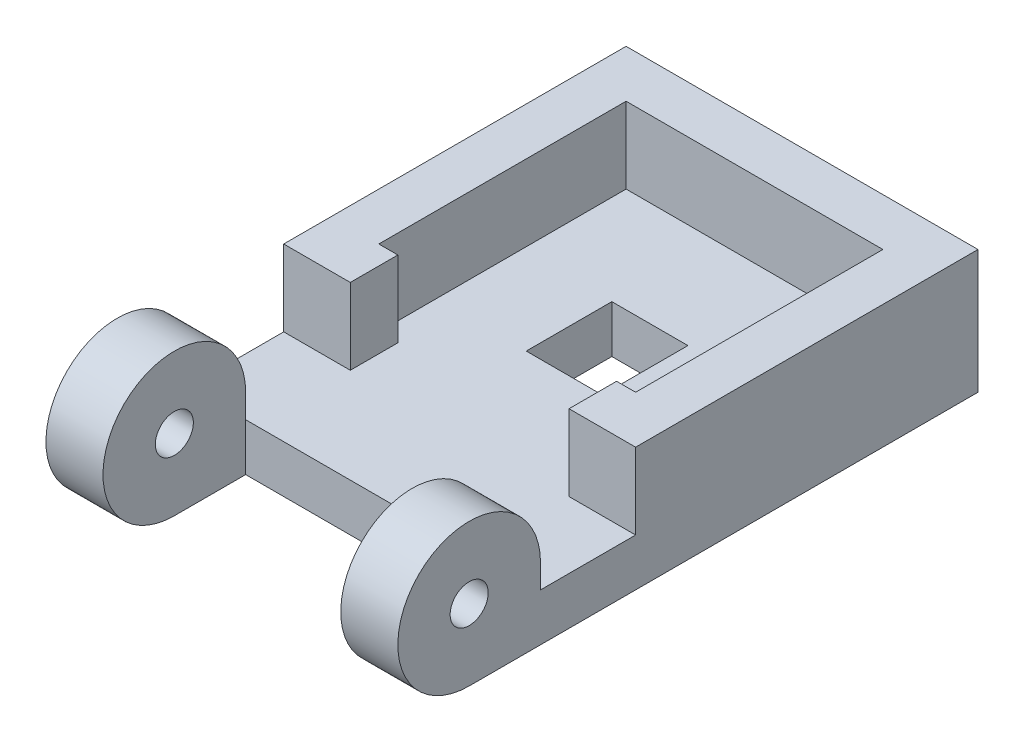
ISO-10303-21;
HEADER;
FILE_DESCRIPTION(('STEP AP214'),'2;1');
FILE_NAME('part.step','',(''),(''),'','','');
FILE_SCHEMA(('AUTOMOTIVE_DESIGN { 1 0 10303 214 1 1 1 1 }'));
ENDSEC;
DATA;
#1=APPLICATION_CONTEXT('core data for automotive mechanical design processes');
#2=APPLICATION_PROTOCOL_DEFINITION('international standard','automotive_design',2000,#1);
#3=PRODUCT_CONTEXT('',#1,'mechanical');
#4=PRODUCT('Part','Part','',(#3));
#5=PRODUCT_RELATED_PRODUCT_CATEGORY('part','',(#4));
#6=PRODUCT_DEFINITION_FORMATION('','',#4);
#7=PRODUCT_DEFINITION_CONTEXT('part definition',#1,'design');
#8=PRODUCT_DEFINITION('design','',#6,#7);
#9=PRODUCT_DEFINITION_SHAPE('','',#8);
#10=(LENGTH_UNIT() NAMED_UNIT(*) SI_UNIT(.MILLI.,.METRE.));
#11=(NAMED_UNIT(*) PLANE_ANGLE_UNIT() SI_UNIT($,.RADIAN.));
#12=(NAMED_UNIT(*) SI_UNIT($,.STERADIAN.) SOLID_ANGLE_UNIT());
#13=UNCERTAINTY_MEASURE_WITH_UNIT(LENGTH_MEASURE(1.E-05),#10,'distance_accuracy_value','');
#14=(GEOMETRIC_REPRESENTATION_CONTEXT(3) GLOBAL_UNCERTAINTY_ASSIGNED_CONTEXT((#13)) GLOBAL_UNIT_ASSIGNED_CONTEXT((#10,
#11,#12)) REPRESENTATION_CONTEXT('',''));
#15=CARTESIAN_POINT('',(0.,0.,0.));
#16=DIRECTION('',(0.,0.,1.));
#17=DIRECTION('',(1.,0.,0.));
#18=AXIS2_PLACEMENT_3D('',#15,#16,#17);
#19=CARTESIAN_POINT('',(0.,0.,0.));
#20=DIRECTION('',(0.,1.,0.));
#21=DIRECTION('',(0.,0.,1.));
#22=AXIS2_PLACEMENT_3D('',#19,#20,#21);
#23=PLANE('',#22);
#24=DIRECTION('',(0.,0.,-1.));
#25=VECTOR('',#24,1.);
#26=CARTESIAN_POINT('',(4.,0.,0.));
#27=LINE('',#26,#25);
#28=CARTESIAN_POINT('',(4.,0.,4.5));
#29=VERTEX_POINT('',#28);
#30=CARTESIAN_POINT('',(4.,0.,-4.5));
#31=VERTEX_POINT('',#30);
#32=EDGE_CURVE('E304',#29,#31,#27,.T.);
#33=ORIENTED_EDGE('',*,*,#32,.T.);
#34=DIRECTION('',(1.,0.,0.));
#35=VECTOR('',#34,1.);
#36=CARTESIAN_POINT('',(0.,0.,-4.5));
#37=LINE('',#36,#35);
#38=CARTESIAN_POINT('',(-4.,0.,-4.5));
#39=VERTEX_POINT('',#38);
#40=EDGE_CURVE('E332',#39,#31,#37,.T.);
#41=ORIENTED_EDGE('',*,*,#40,.F.);
#42=DIRECTION('',(0.,0.,-1.));
#43=VECTOR('',#42,1.);
#44=CARTESIAN_POINT('',(-4.,0.,0.));
#45=LINE('',#44,#43);
#46=CARTESIAN_POINT('',(-4.,0.,4.5));
#47=VERTEX_POINT('',#46);
#48=EDGE_CURVE('E330',#47,#39,#45,.T.);
#49=ORIENTED_EDGE('',*,*,#48,.F.);
#50=DIRECTION('',(1.,0.,0.));
#51=VECTOR('',#50,1.);
#52=CARTESIAN_POINT('',(0.,0.,4.5));
#53=LINE('',#52,#51);
#54=EDGE_CURVE('E327',#47,#29,#53,.T.);
#55=ORIENTED_EDGE('',*,*,#54,.T.);
#56=EDGE_LOOP('',(#33,#41,#49,#55));
#57=FACE_BOUND('',#56,.T.);
#58=DIRECTION('',(0.,0.,-1.));
#59=VECTOR('',#58,1.);
#60=CARTESIAN_POINT('',(-12.5,0.,0.));
#61=LINE('',#60,#59);
#62=CARTESIAN_POINT('',(-12.5,0.,33.));
#63=VERTEX_POINT('',#62);
#64=CARTESIAN_POINT('',(-12.5,0.,25.5));
#65=VERTEX_POINT('',#64);
#66=EDGE_CURVE('E443',#63,#65,#61,.T.);
#67=ORIENTED_EDGE('',*,*,#66,.F.);
#68=DIRECTION('',(-1.,0.,0.));
#69=VECTOR('',#68,1.);
#70=CARTESIAN_POINT('',(18.5,0.,33.));
#71=LINE('',#70,#69);
#72=CARTESIAN_POINT('',(-18.5,0.,33.));
#73=VERTEX_POINT('',#72);
#74=EDGE_CURVE('E228',#63,#73,#71,.T.);
#75=ORIENTED_EDGE('',*,*,#74,.T.);
#76=DIRECTION('',(0.,0.,1.));
#77=VECTOR('',#76,1.);
#78=CARTESIAN_POINT('',(-18.5,0.,0.));
#79=LINE('',#78,#77);
#80=CARTESIAN_POINT('',(-18.5,0.,-20.5));
#81=VERTEX_POINT('',#80);
#82=EDGE_CURVE('E309',#81,#73,#79,.T.);
#83=ORIENTED_EDGE('',*,*,#82,.F.);
#84=DIRECTION('',(1.,0.,0.));
#85=VECTOR('',#84,1.);
#86=CARTESIAN_POINT('',(0.,0.,-20.5));
#87=LINE('',#86,#85);
#88=CARTESIAN_POINT('',(18.5,0.,-20.5));
#89=VERTEX_POINT('',#88);
#90=EDGE_CURVE('E337',#81,#89,#87,.T.);
#91=ORIENTED_EDGE('',*,*,#90,.T.);
#92=DIRECTION('',(0.,0.,1.));
#93=VECTOR('',#92,1.);
#94=CARTESIAN_POINT('',(18.5,0.,0.));
#95=LINE('',#94,#93);
#96=CARTESIAN_POINT('',(18.5,0.,33.));
#97=VERTEX_POINT('',#96);
#98=EDGE_CURVE('E335',#89,#97,#95,.T.);
#99=ORIENTED_EDGE('',*,*,#98,.T.);
#100=CARTESIAN_POINT('',(12.5,0.,33.));
#101=VERTEX_POINT('',#100);
#102=EDGE_CURVE('E222',#97,#101,#71,.T.);
#103=ORIENTED_EDGE('',*,*,#102,.T.);
#104=DIRECTION('',(0.,0.,1.));
#105=VECTOR('',#104,1.);
#106=CARTESIAN_POINT('',(12.5,0.,0.));
#107=LINE('',#106,#105);
#108=CARTESIAN_POINT('',(12.5,0.,25.5));
#109=VERTEX_POINT('',#108);
#110=EDGE_CURVE('E196',#109,#101,#107,.T.);
#111=ORIENTED_EDGE('',*,*,#110,.F.);
#112=DIRECTION('',(1.,0.,0.));
#113=VECTOR('',#112,1.);
#114=CARTESIAN_POINT('',(0.,0.,25.5));
#115=LINE('',#114,#113);
#116=EDGE_CURVE('E210',#65,#109,#115,.T.);
#117=ORIENTED_EDGE('',*,*,#116,.F.);
#118=EDGE_LOOP('',(#67,#75,#83,#91,#99,#103,#111,#117));
#119=FACE_BOUND('',#118,.T.);
#120=ADVANCED_FACE('F35',(#57,#119),#23,.F.);
#121=CARTESIAN_POINT('',(18.5,0.,25.5));
#122=DIRECTION('',(0.,0.,1.));
#123=DIRECTION('',(1.,0.,0.));
#124=AXIS2_PLACEMENT_3D('',#121,#122,#123);
#125=PLANE('',#124);
#126=DIRECTION('',(0.,-1.,0.));
#127=VECTOR('',#126,1.);
#128=CARTESIAN_POINT('',(-12.5,27.,25.5));
#129=LINE('',#128,#127);
#130=CARTESIAN_POINT('',(-12.5,7.5,25.5));
#131=VERTEX_POINT('',#130);
#132=CARTESIAN_POINT('',(-12.5,5.,25.5));
#133=VERTEX_POINT('',#132);
#134=EDGE_CURVE('E452',#131,#133,#129,.T.);
#135=ORIENTED_EDGE('',*,*,#134,.T.);
#136=DIRECTION('',(1.,0.,0.));
#137=VECTOR('',#136,1.);
#138=CARTESIAN_POINT('',(0.,5.,25.5));
#139=LINE('',#138,#137);
#140=CARTESIAN_POINT('',(-18.5,5.,25.5));
#141=VERTEX_POINT('',#140);
#142=EDGE_CURVE('E321',#141,#133,#139,.T.);
#143=ORIENTED_EDGE('',*,*,#142,.F.);
#144=DIRECTION('',(0.,1.,0.));
#145=VECTOR('',#144,1.);
#146=CARTESIAN_POINT('',(-18.5,0.,25.5));
#147=LINE('',#146,#145);
#148=CARTESIAN_POINT('',(-18.5,7.5,25.5));
#149=VERTEX_POINT('',#148);
#150=EDGE_CURVE('E225',#141,#149,#147,.T.);
#151=ORIENTED_EDGE('',*,*,#150,.T.);
#152=DIRECTION('',(-1.,0.,0.));
#153=VECTOR('',#152,1.);
#154=CARTESIAN_POINT('',(18.5,7.5,25.5));
#155=LINE('',#154,#153);
#156=EDGE_CURVE('E217',#131,#149,#155,.T.);
#157=ORIENTED_EDGE('',*,*,#156,.F.);
#158=EDGE_LOOP('',(#135,#143,#151,#157));
#159=FACE_BOUND('',#158,.T.);
#160=ADVANCED_FACE('F459',(#159),#125,.F.);
#161=DIRECTION('',(0.,-1.,0.));
#162=VECTOR('',#161,1.);
#163=CARTESIAN_POINT('',(12.5,27.,25.5));
#164=LINE('',#163,#162);
#165=CARTESIAN_POINT('',(12.5,7.5,25.5));
#166=VERTEX_POINT('',#165);
#167=CARTESIAN_POINT('',(12.5,5.,25.5));
#168=VERTEX_POINT('',#167);
#169=EDGE_CURVE('E193',#166,#168,#164,.T.);
#170=ORIENTED_EDGE('',*,*,#169,.F.);
#171=CARTESIAN_POINT('',(18.5,7.5,25.5));
#172=VERTEX_POINT('',#171);
#173=EDGE_CURVE('E206',#172,#166,#155,.T.);
#174=ORIENTED_EDGE('',*,*,#173,.F.);
#175=DIRECTION('',(0.,1.,0.));
#176=VECTOR('',#175,1.);
#177=CARTESIAN_POINT('',(18.5,0.,25.5));
#178=LINE('',#177,#176);
#179=CARTESIAN_POINT('',(18.5,5.,25.5));
#180=VERTEX_POINT('',#179);
#181=EDGE_CURVE('E438',#180,#172,#178,.T.);
#182=ORIENTED_EDGE('',*,*,#181,.F.);
#183=EDGE_CURVE('E208',#168,#180,#139,.T.);
#184=ORIENTED_EDGE('',*,*,#183,.F.);
#185=EDGE_LOOP('',(#170,#174,#182,#184));
#186=FACE_BOUND('',#185,.T.);
#187=ADVANCED_FACE('F204',(#186),#125,.F.);
#188=CARTESIAN_POINT('',(18.5,7.5,33.));
#189=DIRECTION('',(-1.,0.,0.));
#190=DIRECTION('',(0.,0.,1.));
#191=AXIS2_PLACEMENT_3D('',#188,#189,#190);
#192=CYLINDRICAL_SURFACE('',#191,2.);
#193=CARTESIAN_POINT('',(-18.5,7.5,33.));
#194=DIRECTION('',(-1.,0.,0.));
#195=DIRECTION('',(0.,0.,1.));
#196=AXIS2_PLACEMENT_3D('',#193,#194,#195);
#197=CIRCLE('',#196,2.);
#198=CARTESIAN_POINT('',(-18.5,7.5,35.));
#199=VERTEX_POINT('',#198);
#200=EDGE_CURVE('E433',#199,#199,#197,.T.);
#201=ORIENTED_EDGE('',*,*,#200,.T.);
#202=EDGE_LOOP('',(#201));
#203=FACE_BOUND('',#202,.T.);
#204=CARTESIAN_POINT('',(-12.5,7.5,33.));
#205=DIRECTION('',(1.,0.,0.));
#206=DIRECTION('',(0.,0.,-1.));
#207=AXIS2_PLACEMENT_3D('',#204,#205,#206);
#208=CIRCLE('',#207,2.);
#209=CARTESIAN_POINT('',(-12.5,7.5,31.));
#210=VERTEX_POINT('',#209);
#211=EDGE_CURVE('E435',#210,#210,#208,.F.);
#212=ORIENTED_EDGE('',*,*,#211,.F.);
#213=EDGE_LOOP('',(#212));
#214=FACE_BOUND('',#213,.T.);
#215=ADVANCED_FACE('F476',(#203,#214),#192,.F.);
#216=CARTESIAN_POINT('',(18.5,7.5,33.));
#217=DIRECTION('',(-1.,0.,0.));
#218=DIRECTION('',(0.,0.,1.));
#219=AXIS2_PLACEMENT_3D('',#216,#217,#218);
#220=CIRCLE('',#219,2.);
#221=CARTESIAN_POINT('',(18.5,7.5,35.));
#222=VERTEX_POINT('',#221);
#223=EDGE_CURVE('E430',#222,#222,#220,.T.);
#224=ORIENTED_EDGE('',*,*,#223,.F.);
#225=EDGE_LOOP('',(#224));
#226=FACE_BOUND('',#225,.T.);
#227=CARTESIAN_POINT('',(12.5,7.5,33.));
#228=DIRECTION('',(-1.,0.,0.));
#229=DIRECTION('',(0.,0.,1.));
#230=AXIS2_PLACEMENT_3D('',#227,#228,#229);
#231=CIRCLE('',#230,2.);
#232=CARTESIAN_POINT('',(12.5,7.5,35.));
#233=VERTEX_POINT('',#232);
#234=EDGE_CURVE('E445',#233,#233,#231,.F.);
#235=ORIENTED_EDGE('',*,*,#234,.F.);
#236=EDGE_LOOP('',(#235));
#237=FACE_BOUND('',#236,.T.);
#238=ADVANCED_FACE('F470',(#226,#237),#192,.F.);
#239=CARTESIAN_POINT('',(18.5,7.5,33.));
#240=DIRECTION('',(-1.,0.,0.));
#241=DIRECTION('',(0.,0.,1.));
#242=AXIS2_PLACEMENT_3D('',#239,#240,#241);
#243=CYLINDRICAL_SURFACE('',#242,7.5);
#244=ORIENTED_EDGE('',*,*,#74,.F.);
#245=CARTESIAN_POINT('',(-12.5,7.5,33.));
#246=DIRECTION('',(1.,0.,0.));
#247=DIRECTION('',(0.,0.,-1.));
#248=AXIS2_PLACEMENT_3D('',#245,#246,#247);
#249=CIRCLE('',#248,7.5);
#250=EDGE_CURVE('E11',#63,#131,#249,.F.);
#251=ORIENTED_EDGE('',*,*,#250,.T.);
#252=ORIENTED_EDGE('',*,*,#156,.T.);
#253=CARTESIAN_POINT('',(-18.5,7.5,33.));
#254=DIRECTION('',(-1.,0.,0.));
#255=DIRECTION('',(0.,0.,1.));
#256=AXIS2_PLACEMENT_3D('',#253,#254,#255);
#257=CIRCLE('',#256,7.5);
#258=EDGE_CURVE('E427',#73,#149,#257,.T.);
#259=ORIENTED_EDGE('',*,*,#258,.F.);
#260=EDGE_LOOP('',(#244,#251,#252,#259));
#261=FACE_BOUND('',#260,.T.);
#262=ADVANCED_FACE('F468',(#261),#243,.T.);
#263=CARTESIAN_POINT('',(12.5,7.5,33.));
#264=DIRECTION('',(-1.,0.,0.));
#265=DIRECTION('',(0.,0.,1.));
#266=AXIS2_PLACEMENT_3D('',#263,#264,#265);
#267=CIRCLE('',#266,7.5);
#268=EDGE_CURVE('E43',#166,#101,#267,.F.);
#269=ORIENTED_EDGE('',*,*,#268,.T.);
#270=ORIENTED_EDGE('',*,*,#102,.F.);
#271=CARTESIAN_POINT('',(18.5,7.5,33.));
#272=DIRECTION('',(-1.,0.,0.));
#273=DIRECTION('',(0.,0.,1.));
#274=AXIS2_PLACEMENT_3D('',#271,#272,#273);
#275=CIRCLE('',#274,7.5);
#276=EDGE_CURVE('E215',#97,#172,#275,.T.);
#277=ORIENTED_EDGE('',*,*,#276,.T.);
#278=ORIENTED_EDGE('',*,*,#173,.T.);
#279=EDGE_LOOP('',(#269,#270,#277,#278));
#280=FACE_BOUND('',#279,.T.);
#281=ADVANCED_FACE('F213',(#280),#243,.T.);
#282=CARTESIAN_POINT('',(0.,5.,0.));
#283=DIRECTION('',(0.,1.,0.));
#284=DIRECTION('',(0.,0.,1.));
#285=AXIS2_PLACEMENT_3D('',#282,#283,#284);
#286=PLANE('',#285);
#287=DIRECTION('',(0.,0.,-1.));
#288=VECTOR('',#287,1.);
#289=CARTESIAN_POINT('',(4.,5.,0.));
#290=LINE('',#289,#288);
#291=CARTESIAN_POINT('',(4.,5.,4.5));
#292=VERTEX_POINT('',#291);
#293=CARTESIAN_POINT('',(4.,5.,-4.5));
#294=VERTEX_POINT('',#293);
#295=EDGE_CURVE('E305',#292,#294,#290,.T.);
#296=ORIENTED_EDGE('',*,*,#295,.F.);
#297=DIRECTION('',(1.,0.,0.));
#298=VECTOR('',#297,1.);
#299=CARTESIAN_POINT('',(0.,5.,4.5));
#300=LINE('',#299,#298);
#301=CARTESIAN_POINT('',(-4.,5.,4.5));
#302=VERTEX_POINT('',#301);
#303=EDGE_CURVE('E308',#302,#292,#300,.T.);
#304=ORIENTED_EDGE('',*,*,#303,.F.);
#305=DIRECTION('',(0.,0.,-1.));
#306=VECTOR('',#305,1.);
#307=CARTESIAN_POINT('',(-4.,5.,0.));
#308=LINE('',#307,#306);
#309=CARTESIAN_POINT('',(-4.,5.,-4.5));
#310=VERTEX_POINT('',#309);
#311=EDGE_CURVE('E312',#302,#310,#308,.T.);
#312=ORIENTED_EDGE('',*,*,#311,.T.);
#313=DIRECTION('',(1.,0.,0.));
#314=VECTOR('',#313,1.);
#315=CARTESIAN_POINT('',(0.,5.,-4.5));
#316=LINE('',#315,#314);
#317=EDGE_CURVE('E314',#310,#294,#316,.T.);
#318=ORIENTED_EDGE('',*,*,#317,.T.);
#319=EDGE_LOOP('',(#296,#304,#312,#318));
#320=FACE_BOUND('',#319,.T.);
#321=DIRECTION('',(0.,0.,1.));
#322=VECTOR('',#321,1.);
#323=CARTESIAN_POINT('',(18.5,5.,0.));
#324=LINE('',#323,#322);
#325=CARTESIAN_POINT('',(18.5,5.,15.5));
#326=VERTEX_POINT('',#325);
#327=EDGE_CURVE('E316',#326,#180,#324,.T.);
#328=ORIENTED_EDGE('',*,*,#327,.F.);
#329=DIRECTION('',(-1.,0.,0.));
#330=VECTOR('',#329,1.);
#331=CARTESIAN_POINT('',(0.,5.,15.5));
#332=LINE('',#331,#330);
#333=CARTESIAN_POINT('',(11.5,5.,15.5));
#334=VERTEX_POINT('',#333);
#335=EDGE_CURVE('E50',#326,#334,#332,.T.);
#336=ORIENTED_EDGE('',*,*,#335,.T.);
#337=DIRECTION('',(0.,0.,1.));
#338=VECTOR('',#337,1.);
#339=CARTESIAN_POINT('',(11.5,5.,0.));
#340=LINE('',#339,#338);
#341=CARTESIAN_POINT('',(11.5,5.,10.5));
#342=VERTEX_POINT('',#341);
#343=EDGE_CURVE('E55',#342,#334,#340,.T.);
#344=ORIENTED_EDGE('',*,*,#343,.F.);
#345=DIRECTION('',(1.,0.,0.));
#346=VECTOR('',#345,1.);
#347=CARTESIAN_POINT('',(0.,5.,10.5));
#348=LINE('',#347,#346);
#349=CARTESIAN_POINT('',(13.5,5.,10.5));
#350=VERTEX_POINT('',#349);
#351=EDGE_CURVE('E273',#342,#350,#348,.T.);
#352=ORIENTED_EDGE('',*,*,#351,.T.);
#353=DIRECTION('',(0.,0.,1.));
#354=VECTOR('',#353,1.);
#355=CARTESIAN_POINT('',(13.5,5.,0.));
#356=LINE('',#355,#354);
#357=CARTESIAN_POINT('',(13.5,5.,-15.5));
#358=VERTEX_POINT('',#357);
#359=EDGE_CURVE('E270',#358,#350,#356,.T.);
#360=ORIENTED_EDGE('',*,*,#359,.F.);
#361=DIRECTION('',(1.,0.,0.));
#362=VECTOR('',#361,1.);
#363=CARTESIAN_POINT('',(0.,5.,-15.5));
#364=LINE('',#363,#362);
#365=CARTESIAN_POINT('',(-13.5,5.,-15.5));
#366=VERTEX_POINT('',#365);
#367=EDGE_CURVE('E267',#366,#358,#364,.T.);
#368=ORIENTED_EDGE('',*,*,#367,.F.);
#369=DIRECTION('',(0.,0.,1.));
#370=VECTOR('',#369,1.);
#371=CARTESIAN_POINT('',(-13.5,5.,0.));
#372=LINE('',#371,#370);
#373=CARTESIAN_POINT('',(-13.5,5.,10.5));
#374=VERTEX_POINT('',#373);
#375=EDGE_CURVE('E265',#366,#374,#372,.T.);
#376=ORIENTED_EDGE('',*,*,#375,.T.);
#377=DIRECTION('',(1.,0.,0.));
#378=VECTOR('',#377,1.);
#379=CARTESIAN_POINT('',(0.,5.,10.5));
#380=LINE('',#379,#378);
#381=CARTESIAN_POINT('',(-11.5,5.,10.5));
#382=VERTEX_POINT('',#381);
#383=EDGE_CURVE('E263',#374,#382,#380,.T.);
#384=ORIENTED_EDGE('',*,*,#383,.T.);
#385=DIRECTION('',(0.,0.,1.));
#386=VECTOR('',#385,1.);
#387=CARTESIAN_POINT('',(-11.5,5.,0.));
#388=LINE('',#387,#386);
#389=CARTESIAN_POINT('',(-11.5,5.,15.5));
#390=VERTEX_POINT('',#389);
#391=EDGE_CURVE('E220',#382,#390,#388,.T.);
#392=ORIENTED_EDGE('',*,*,#391,.T.);
#393=DIRECTION('',(1.,0.,0.));
#394=VECTOR('',#393,1.);
#395=CARTESIAN_POINT('',(0.,5.,15.5));
#396=LINE('',#395,#394);
#397=CARTESIAN_POINT('',(-18.5,5.,15.5));
#398=VERTEX_POINT('',#397);
#399=EDGE_CURVE('E216',#398,#390,#396,.T.);
#400=ORIENTED_EDGE('',*,*,#399,.F.);
#401=DIRECTION('',(0.,0.,1.));
#402=VECTOR('',#401,1.);
#403=CARTESIAN_POINT('',(-18.5,5.,0.));
#404=LINE('',#403,#402);
#405=EDGE_CURVE('E319',#398,#141,#404,.T.);
#406=ORIENTED_EDGE('',*,*,#405,.T.);
#407=ORIENTED_EDGE('',*,*,#142,.T.);
#408=DIRECTION('',(1.,0.,0.));
#409=VECTOR('',#408,1.);
#410=CARTESIAN_POINT('',(0.,5.,25.5));
#411=LINE('',#410,#409);
#412=EDGE_CURVE('E449',#133,#168,#411,.T.);
#413=ORIENTED_EDGE('',*,*,#412,.T.);
#414=ORIENTED_EDGE('',*,*,#183,.T.);
#415=EDGE_LOOP('',(#328,#336,#344,#352,#360,#368,#376,#384,#392,#400,#406,#407,#413,#414));
#416=FACE_BOUND('',#415,.T.);
#417=ADVANCED_FACE('F372',(#320,#416),#286,.T.);
#418=CARTESIAN_POINT('',(18.5,5.,0.));
#419=DIRECTION('',(1.,0.,0.));
#420=DIRECTION('',(0.,0.,-1.));
#421=AXIS2_PLACEMENT_3D('',#418,#419,#420);
#422=PLANE('',#421);
#423=ORIENTED_EDGE('',*,*,#98,.F.);
#424=DIRECTION('',(0.,-1.,0.));
#425=VECTOR('',#424,1.);
#426=CARTESIAN_POINT('',(18.5,5.,-20.5));
#427=LINE('',#426,#425);
#428=CARTESIAN_POINT('',(18.5,13.,-20.5));
#429=VERTEX_POINT('',#428);
#430=EDGE_CURVE('E201',#429,#89,#427,.T.);
#431=ORIENTED_EDGE('',*,*,#430,.F.);
#432=DIRECTION('',(0.,0.,-1.));
#433=VECTOR('',#432,1.);
#434=CARTESIAN_POINT('',(18.5,13.,0.));
#435=LINE('',#434,#433);
#436=CARTESIAN_POINT('',(18.5,13.,15.5));
#437=VERTEX_POINT('',#436);
#438=EDGE_CURVE('E255',#437,#429,#435,.T.);
#439=ORIENTED_EDGE('',*,*,#438,.F.);
#440=DIRECTION('',(0.,-1.,0.));
#441=VECTOR('',#440,1.);
#442=CARTESIAN_POINT('',(18.5,13.,15.5));
#443=LINE('',#442,#441);
#444=EDGE_CURVE('E260',#437,#326,#443,.T.);
#445=ORIENTED_EDGE('',*,*,#444,.T.);
#446=ORIENTED_EDGE('',*,*,#327,.T.);
#447=ORIENTED_EDGE('',*,*,#181,.T.);
#448=ORIENTED_EDGE('',*,*,#276,.F.);
#449=EDGE_LOOP('',(#423,#431,#439,#445,#446,#447,#448));
#450=FACE_BOUND('',#449,.T.);
#451=ORIENTED_EDGE('',*,*,#223,.T.);
#452=EDGE_LOOP('',(#451));
#453=FACE_BOUND('',#452,.T.);
#454=ADVANCED_FACE('F374',(#450,#453),#422,.T.);
#455=CARTESIAN_POINT('',(0.,5.,-20.5));
#456=DIRECTION('',(0.,0.,-1.));
#457=DIRECTION('',(-1.,0.,0.));
#458=AXIS2_PLACEMENT_3D('',#455,#456,#457);
#459=PLANE('',#458);
#460=ORIENTED_EDGE('',*,*,#90,.F.);
#461=DIRECTION('',(0.,-1.,0.));
#462=VECTOR('',#461,1.);
#463=CARTESIAN_POINT('',(-18.5,5.,-20.5));
#464=LINE('',#463,#462);
#465=CARTESIAN_POINT('',(-18.5,13.,-20.5));
#466=VERTEX_POINT('',#465);
#467=EDGE_CURVE('E342',#466,#81,#464,.T.);
#468=ORIENTED_EDGE('',*,*,#467,.F.);
#469=DIRECTION('',(-1.,0.,0.));
#470=VECTOR('',#469,1.);
#471=CARTESIAN_POINT('',(0.,13.,-20.5));
#472=LINE('',#471,#470);
#473=EDGE_CURVE('E258',#429,#466,#472,.T.);
#474=ORIENTED_EDGE('',*,*,#473,.F.);
#475=ORIENTED_EDGE('',*,*,#430,.T.);
#476=EDGE_LOOP('',(#460,#468,#474,#475));
#477=FACE_BOUND('',#476,.T.);
#478=ADVANCED_FACE('F489',(#477),#459,.T.);
#479=CARTESIAN_POINT('',(-18.5,5.,0.));
#480=DIRECTION('',(1.,0.,0.));
#481=DIRECTION('',(0.,0.,-1.));
#482=AXIS2_PLACEMENT_3D('',#479,#480,#481);
#483=PLANE('',#482);
#484=ORIENTED_EDGE('',*,*,#82,.T.);
#485=ORIENTED_EDGE('',*,*,#258,.T.);
#486=ORIENTED_EDGE('',*,*,#150,.F.);
#487=ORIENTED_EDGE('',*,*,#405,.F.);
#488=DIRECTION('',(0.,-1.,0.));
#489=VECTOR('',#488,1.);
#490=CARTESIAN_POINT('',(-18.5,13.,15.5));
#491=LINE('',#490,#489);
#492=CARTESIAN_POINT('',(-18.5,13.,15.5));
#493=VERTEX_POINT('',#492);
#494=EDGE_CURVE('E301',#493,#398,#491,.T.);
#495=ORIENTED_EDGE('',*,*,#494,.F.);
#496=DIRECTION('',(0.,0.,1.));
#497=VECTOR('',#496,1.);
#498=CARTESIAN_POINT('',(-18.5,13.,0.));
#499=LINE('',#498,#497);
#500=EDGE_CURVE('E229',#466,#493,#499,.T.);
#501=ORIENTED_EDGE('',*,*,#500,.F.);
#502=ORIENTED_EDGE('',*,*,#467,.T.);
#503=EDGE_LOOP('',(#484,#485,#486,#487,#495,#501,#502));
#504=FACE_BOUND('',#503,.T.);
#505=ORIENTED_EDGE('',*,*,#200,.F.);
#506=EDGE_LOOP('',(#505));
#507=FACE_BOUND('',#506,.T.);
#508=ADVANCED_FACE('F421',(#504,#507),#483,.F.);
#509=CARTESIAN_POINT('',(4.,5.,0.));
#510=DIRECTION('',(-1.,0.,0.));
#511=DIRECTION('',(0.,0.,1.));
#512=AXIS2_PLACEMENT_3D('',#509,#510,#511);
#513=PLANE('',#512);
#514=ORIENTED_EDGE('',*,*,#32,.F.);
#515=DIRECTION('',(0.,-1.,0.));
#516=VECTOR('',#515,1.);
#517=CARTESIAN_POINT('',(4.,5.,4.5));
#518=LINE('',#517,#516);
#519=EDGE_CURVE('E344',#292,#29,#518,.T.);
#520=ORIENTED_EDGE('',*,*,#519,.F.);
#521=ORIENTED_EDGE('',*,*,#295,.T.);
#522=DIRECTION('',(0.,-1.,0.));
#523=VECTOR('',#522,1.);
#524=CARTESIAN_POINT('',(4.,5.,-4.5));
#525=LINE('',#524,#523);
#526=EDGE_CURVE('E324',#294,#31,#525,.T.);
#527=ORIENTED_EDGE('',*,*,#526,.T.);
#528=EDGE_LOOP('',(#514,#520,#521,#527));
#529=FACE_BOUND('',#528,.T.);
#530=ADVANCED_FACE('F37',(#529),#513,.T.);
#531=CARTESIAN_POINT('',(0.,5.,4.5));
#532=DIRECTION('',(0.,0.,-1.));
#533=DIRECTION('',(-1.,0.,0.));
#534=AXIS2_PLACEMENT_3D('',#531,#532,#533);
#535=PLANE('',#534);
#536=ORIENTED_EDGE('',*,*,#54,.F.);
#537=DIRECTION('',(0.,-1.,0.));
#538=VECTOR('',#537,1.);
#539=CARTESIAN_POINT('',(-4.,5.,4.5));
#540=LINE('',#539,#538);
#541=EDGE_CURVE('E350',#302,#47,#540,.T.);
#542=ORIENTED_EDGE('',*,*,#541,.F.);
#543=ORIENTED_EDGE('',*,*,#303,.T.);
#544=ORIENTED_EDGE('',*,*,#519,.T.);
#545=EDGE_LOOP('',(#536,#542,#543,#544));
#546=FACE_BOUND('',#545,.T.);
#547=ADVANCED_FACE('F355',(#546),#535,.T.);
#548=CARTESIAN_POINT('',(-4.,5.,0.));
#549=DIRECTION('',(-1.,0.,0.));
#550=DIRECTION('',(0.,0.,1.));
#551=AXIS2_PLACEMENT_3D('',#548,#549,#550);
#552=PLANE('',#551);
#553=ORIENTED_EDGE('',*,*,#48,.T.);
#554=DIRECTION('',(0.,-1.,0.));
#555=VECTOR('',#554,1.);
#556=CARTESIAN_POINT('',(-4.,5.,-4.5));
#557=LINE('',#556,#555);
#558=EDGE_CURVE('E347',#310,#39,#557,.T.);
#559=ORIENTED_EDGE('',*,*,#558,.F.);
#560=ORIENTED_EDGE('',*,*,#311,.F.);
#561=ORIENTED_EDGE('',*,*,#541,.T.);
#562=EDGE_LOOP('',(#553,#559,#560,#561));
#563=FACE_BOUND('',#562,.T.);
#564=ADVANCED_FACE('F366',(#563),#552,.F.);
#565=CARTESIAN_POINT('',(0.,5.,-4.5));
#566=DIRECTION('',(0.,0.,-1.));
#567=DIRECTION('',(-1.,0.,0.));
#568=AXIS2_PLACEMENT_3D('',#565,#566,#567);
#569=PLANE('',#568);
#570=ORIENTED_EDGE('',*,*,#40,.T.);
#571=ORIENTED_EDGE('',*,*,#526,.F.);
#572=ORIENTED_EDGE('',*,*,#317,.F.);
#573=ORIENTED_EDGE('',*,*,#558,.T.);
#574=EDGE_LOOP('',(#570,#571,#572,#573));
#575=FACE_BOUND('',#574,.T.);
#576=ADVANCED_FACE('F370',(#575),#569,.F.);
#577=CARTESIAN_POINT('',(0.,13.,15.5));
#578=DIRECTION('',(0.,0.,-1.));
#579=DIRECTION('',(-1.,0.,0.));
#580=AXIS2_PLACEMENT_3D('',#577,#578,#579);
#581=PLANE('',#580);
#582=ORIENTED_EDGE('',*,*,#399,.T.);
#583=DIRECTION('',(0.,-1.,0.));
#584=VECTOR('',#583,1.);
#585=CARTESIAN_POINT('',(-11.5,13.,15.5));
#586=LINE('',#585,#584);
#587=CARTESIAN_POINT('',(-11.5,13.,15.5));
#588=VERTEX_POINT('',#587);
#589=EDGE_CURVE('E298',#588,#390,#586,.T.);
#590=ORIENTED_EDGE('',*,*,#589,.F.);
#591=DIRECTION('',(1.,0.,0.));
#592=VECTOR('',#591,1.);
#593=CARTESIAN_POINT('',(0.,13.,15.5));
#594=LINE('',#593,#592);
#595=EDGE_CURVE('E232',#493,#588,#594,.T.);
#596=ORIENTED_EDGE('',*,*,#595,.F.);
#597=ORIENTED_EDGE('',*,*,#494,.T.);
#598=EDGE_LOOP('',(#582,#590,#596,#597));
#599=FACE_BOUND('',#598,.T.);
#600=ADVANCED_FACE('F415',(#599),#581,.F.);
#601=CARTESIAN_POINT('',(-11.5,13.,0.));
#602=DIRECTION('',(1.,0.,0.));
#603=DIRECTION('',(0.,0.,-1.));
#604=AXIS2_PLACEMENT_3D('',#601,#602,#603);
#605=PLANE('',#604);
#606=ORIENTED_EDGE('',*,*,#391,.F.);
#607=DIRECTION('',(0.,-1.,0.));
#608=VECTOR('',#607,1.);
#609=CARTESIAN_POINT('',(-11.5,13.,10.5));
#610=LINE('',#609,#608);
#611=CARTESIAN_POINT('',(-11.5,13.,10.5));
#612=VERTEX_POINT('',#611);
#613=EDGE_CURVE('E295',#612,#382,#610,.T.);
#614=ORIENTED_EDGE('',*,*,#613,.F.);
#615=DIRECTION('',(0.,0.,1.));
#616=VECTOR('',#615,1.);
#617=CARTESIAN_POINT('',(-11.5,13.,0.));
#618=LINE('',#617,#616);
#619=EDGE_CURVE('E234',#612,#588,#618,.T.);
#620=ORIENTED_EDGE('',*,*,#619,.T.);
#621=ORIENTED_EDGE('',*,*,#589,.T.);
#622=EDGE_LOOP('',(#606,#614,#620,#621));
#623=FACE_BOUND('',#622,.T.);
#624=ADVANCED_FACE('F412',(#623),#605,.T.);
#625=CARTESIAN_POINT('',(0.,13.,10.5));
#626=DIRECTION('',(0.,0.,-1.));
#627=DIRECTION('',(-1.,0.,0.));
#628=AXIS2_PLACEMENT_3D('',#625,#626,#627);
#629=PLANE('',#628);
#630=ORIENTED_EDGE('',*,*,#383,.F.);
#631=DIRECTION('',(0.,-1.,0.));
#632=VECTOR('',#631,1.);
#633=CARTESIAN_POINT('',(-13.5,13.,10.5));
#634=LINE('',#633,#632);
#635=CARTESIAN_POINT('',(-13.5,13.,10.5));
#636=VERTEX_POINT('',#635);
#637=EDGE_CURVE('E292',#636,#374,#634,.T.);
#638=ORIENTED_EDGE('',*,*,#637,.F.);
#639=DIRECTION('',(1.,0.,0.));
#640=VECTOR('',#639,1.);
#641=CARTESIAN_POINT('',(0.,13.,10.5));
#642=LINE('',#641,#640);
#643=EDGE_CURVE('E237',#636,#612,#642,.T.);
#644=ORIENTED_EDGE('',*,*,#643,.T.);
#645=ORIENTED_EDGE('',*,*,#613,.T.);
#646=EDGE_LOOP('',(#630,#638,#644,#645));
#647=FACE_BOUND('',#646,.T.);
#648=ADVANCED_FACE('F410',(#647),#629,.T.);
#649=CARTESIAN_POINT('',(-13.5,13.,0.));
#650=DIRECTION('',(1.,0.,0.));
#651=DIRECTION('',(0.,0.,-1.));
#652=AXIS2_PLACEMENT_3D('',#649,#650,#651);
#653=PLANE('',#652);
#654=ORIENTED_EDGE('',*,*,#375,.F.);
#655=DIRECTION('',(0.,-1.,0.));
#656=VECTOR('',#655,1.);
#657=CARTESIAN_POINT('',(-13.5,13.,-15.5));
#658=LINE('',#657,#656);
#659=CARTESIAN_POINT('',(-13.5,13.,-15.5));
#660=VERTEX_POINT('',#659);
#661=EDGE_CURVE('E289',#660,#366,#658,.T.);
#662=ORIENTED_EDGE('',*,*,#661,.F.);
#663=DIRECTION('',(0.,0.,1.));
#664=VECTOR('',#663,1.);
#665=CARTESIAN_POINT('',(-13.5,13.,0.));
#666=LINE('',#665,#664);
#667=EDGE_CURVE('E240',#660,#636,#666,.T.);
#668=ORIENTED_EDGE('',*,*,#667,.T.);
#669=ORIENTED_EDGE('',*,*,#637,.T.);
#670=EDGE_LOOP('',(#654,#662,#668,#669));
#671=FACE_BOUND('',#670,.T.);
#672=ADVANCED_FACE('F406',(#671),#653,.T.);
#673=CARTESIAN_POINT('',(0.,13.,-15.5));
#674=DIRECTION('',(0.,0.,-1.));
#675=DIRECTION('',(-1.,0.,0.));
#676=AXIS2_PLACEMENT_3D('',#673,#674,#675);
#677=PLANE('',#676);
#678=ORIENTED_EDGE('',*,*,#367,.T.);
#679=DIRECTION('',(0.,-1.,0.));
#680=VECTOR('',#679,1.);
#681=CARTESIAN_POINT('',(13.5,13.,-15.5));
#682=LINE('',#681,#680);
#683=CARTESIAN_POINT('',(13.5,13.,-15.5));
#684=VERTEX_POINT('',#683);
#685=EDGE_CURVE('E286',#684,#358,#682,.T.);
#686=ORIENTED_EDGE('',*,*,#685,.F.);
#687=DIRECTION('',(1.,0.,0.));
#688=VECTOR('',#687,1.);
#689=CARTESIAN_POINT('',(0.,13.,-15.5));
#690=LINE('',#689,#688);
#691=EDGE_CURVE('E243',#660,#684,#690,.T.);
#692=ORIENTED_EDGE('',*,*,#691,.F.);
#693=ORIENTED_EDGE('',*,*,#661,.T.);
#694=EDGE_LOOP('',(#678,#686,#692,#693));
#695=FACE_BOUND('',#694,.T.);
#696=ADVANCED_FACE('F395',(#695),#677,.F.);
#697=CARTESIAN_POINT('',(13.5,13.,0.));
#698=DIRECTION('',(1.,0.,0.));
#699=DIRECTION('',(0.,0.,-1.));
#700=AXIS2_PLACEMENT_3D('',#697,#698,#699);
#701=PLANE('',#700);
#702=ORIENTED_EDGE('',*,*,#359,.T.);
#703=DIRECTION('',(0.,-1.,0.));
#704=VECTOR('',#703,1.);
#705=CARTESIAN_POINT('',(13.5,13.,10.5));
#706=LINE('',#705,#704);
#707=CARTESIAN_POINT('',(13.5,13.,10.5));
#708=VERTEX_POINT('',#707);
#709=EDGE_CURVE('E283',#708,#350,#706,.T.);
#710=ORIENTED_EDGE('',*,*,#709,.F.);
#711=DIRECTION('',(0.,0.,1.));
#712=VECTOR('',#711,1.);
#713=CARTESIAN_POINT('',(13.5,13.,0.));
#714=LINE('',#713,#712);
#715=EDGE_CURVE('E245',#684,#708,#714,.T.);
#716=ORIENTED_EDGE('',*,*,#715,.F.);
#717=ORIENTED_EDGE('',*,*,#685,.T.);
#718=EDGE_LOOP('',(#702,#710,#716,#717));
#719=FACE_BOUND('',#718,.T.);
#720=ADVANCED_FACE('F399',(#719),#701,.F.);
#721=CARTESIAN_POINT('',(0.,13.,10.5));
#722=DIRECTION('',(0.,0.,-1.));
#723=DIRECTION('',(-1.,0.,0.));
#724=AXIS2_PLACEMENT_3D('',#721,#722,#723);
#725=PLANE('',#724);
#726=ORIENTED_EDGE('',*,*,#351,.F.);
#727=DIRECTION('',(0.,-1.,0.));
#728=VECTOR('',#727,1.);
#729=CARTESIAN_POINT('',(11.5,13.,10.5));
#730=LINE('',#729,#728);
#731=CARTESIAN_POINT('',(11.5,13.,10.5));
#732=VERTEX_POINT('',#731);
#733=EDGE_CURVE('E281',#732,#342,#730,.T.);
#734=ORIENTED_EDGE('',*,*,#733,.F.);
#735=DIRECTION('',(1.,0.,0.));
#736=VECTOR('',#735,1.);
#737=CARTESIAN_POINT('',(0.,13.,10.5));
#738=LINE('',#737,#736);
#739=EDGE_CURVE('E247',#732,#708,#738,.T.);
#740=ORIENTED_EDGE('',*,*,#739,.T.);
#741=ORIENTED_EDGE('',*,*,#709,.T.);
#742=EDGE_LOOP('',(#726,#734,#740,#741));
#743=FACE_BOUND('',#742,.T.);
#744=ADVANCED_FACE('F390',(#743),#725,.T.);
#745=CARTESIAN_POINT('',(11.5,13.,0.));
#746=DIRECTION('',(1.,0.,0.));
#747=DIRECTION('',(0.,0.,-1.));
#748=AXIS2_PLACEMENT_3D('',#745,#746,#747);
#749=PLANE('',#748);
#750=ORIENTED_EDGE('',*,*,#343,.T.);
#751=DIRECTION('',(0.,-1.,0.));
#752=VECTOR('',#751,1.);
#753=CARTESIAN_POINT('',(11.5,13.,15.5));
#754=LINE('',#753,#752);
#755=CARTESIAN_POINT('',(11.5,13.,15.5));
#756=VERTEX_POINT('',#755);
#757=EDGE_CURVE('E279',#756,#334,#754,.T.);
#758=ORIENTED_EDGE('',*,*,#757,.F.);
#759=DIRECTION('',(0.,0.,1.));
#760=VECTOR('',#759,1.);
#761=CARTESIAN_POINT('',(11.5,13.,0.));
#762=LINE('',#761,#760);
#763=EDGE_CURVE('E250',#732,#756,#762,.T.);
#764=ORIENTED_EDGE('',*,*,#763,.F.);
#765=ORIENTED_EDGE('',*,*,#733,.T.);
#766=EDGE_LOOP('',(#750,#758,#764,#765));
#767=FACE_BOUND('',#766,.T.);
#768=ADVANCED_FACE('F386',(#767),#749,.F.);
#769=CARTESIAN_POINT('',(0.,13.,15.5));
#770=DIRECTION('',(0.,0.,1.));
#771=DIRECTION('',(1.,0.,0.));
#772=AXIS2_PLACEMENT_3D('',#769,#770,#771);
#773=PLANE('',#772);
#774=ORIENTED_EDGE('',*,*,#335,.F.);
#775=ORIENTED_EDGE('',*,*,#444,.F.);
#776=DIRECTION('',(-1.,0.,0.));
#777=VECTOR('',#776,1.);
#778=CARTESIAN_POINT('',(0.,13.,15.5));
#779=LINE('',#778,#777);
#780=EDGE_CURVE('E252',#437,#756,#779,.T.);
#781=ORIENTED_EDGE('',*,*,#780,.T.);
#782=ORIENTED_EDGE('',*,*,#757,.T.);
#783=EDGE_LOOP('',(#774,#775,#781,#782));
#784=FACE_BOUND('',#783,.T.);
#785=ADVANCED_FACE('F382',(#784),#773,.T.);
#786=CARTESIAN_POINT('',(0.,13.,0.));
#787=DIRECTION('',(0.,1.,0.));
#788=DIRECTION('',(0.,0.,1.));
#789=AXIS2_PLACEMENT_3D('',#786,#787,#788);
#790=PLANE('',#789);
#791=ORIENTED_EDGE('',*,*,#500,.T.);
#792=ORIENTED_EDGE('',*,*,#595,.T.);
#793=ORIENTED_EDGE('',*,*,#619,.F.);
#794=ORIENTED_EDGE('',*,*,#643,.F.);
#795=ORIENTED_EDGE('',*,*,#667,.F.);
#796=ORIENTED_EDGE('',*,*,#691,.T.);
#797=ORIENTED_EDGE('',*,*,#715,.T.);
#798=ORIENTED_EDGE('',*,*,#739,.F.);
#799=ORIENTED_EDGE('',*,*,#763,.T.);
#800=ORIENTED_EDGE('',*,*,#780,.F.);
#801=ORIENTED_EDGE('',*,*,#438,.T.);
#802=ORIENTED_EDGE('',*,*,#473,.T.);
#803=EDGE_LOOP('',(#791,#792,#793,#794,#795,#796,#797,#798,#799,#800,#801,#802));
#804=FACE_BOUND('',#803,.T.);
#805=ADVANCED_FACE('F401',(#804),#790,.T.);
#806=CARTESIAN_POINT('',(-12.5,27.,25.5));
#807=DIRECTION('',(1.,0.,0.));
#808=DIRECTION('',(0.,0.,-1.));
#809=AXIS2_PLACEMENT_3D('',#806,#807,#808);
#810=PLANE('',#809);
#811=ORIENTED_EDGE('',*,*,#66,.T.);
#812=EDGE_CURVE('E453',#133,#65,#129,.T.);
#813=ORIENTED_EDGE('',*,*,#812,.F.);
#814=ORIENTED_EDGE('',*,*,#134,.F.);
#815=ORIENTED_EDGE('',*,*,#250,.F.);
#816=EDGE_LOOP('',(#811,#813,#814,#815));
#817=FACE_BOUND('',#816,.T.);
#818=ORIENTED_EDGE('',*,*,#211,.T.);
#819=EDGE_LOOP('',(#818));
#820=FACE_BOUND('',#819,.T.);
#821=ADVANCED_FACE('F462',(#817,#820),#810,.T.);
#822=CARTESIAN_POINT('',(12.5,27.,25.5));
#823=DIRECTION('',(-1.,0.,0.));
#824=DIRECTION('',(0.,0.,1.));
#825=AXIS2_PLACEMENT_3D('',#822,#823,#824);
#826=PLANE('',#825);
#827=ORIENTED_EDGE('',*,*,#110,.T.);
#828=ORIENTED_EDGE('',*,*,#268,.F.);
#829=ORIENTED_EDGE('',*,*,#169,.T.);
#830=EDGE_CURVE('E211',#168,#109,#164,.T.);
#831=ORIENTED_EDGE('',*,*,#830,.T.);
#832=EDGE_LOOP('',(#827,#828,#829,#831));
#833=FACE_BOUND('',#832,.T.);
#834=ORIENTED_EDGE('',*,*,#234,.T.);
#835=EDGE_LOOP('',(#834));
#836=FACE_BOUND('',#835,.T.);
#837=ADVANCED_FACE('F190',(#833,#836),#826,.T.);
#838=CARTESIAN_POINT('',(-12.5,27.,25.5));
#839=DIRECTION('',(0.,0.,1.));
#840=DIRECTION('',(1.,0.,0.));
#841=AXIS2_PLACEMENT_3D('',#838,#839,#840);
#842=PLANE('',#841);
#843=ORIENTED_EDGE('',*,*,#812,.T.);
#844=ORIENTED_EDGE('',*,*,#116,.T.);
#845=ORIENTED_EDGE('',*,*,#830,.F.);
#846=ORIENTED_EDGE('',*,*,#412,.F.);
#847=EDGE_LOOP('',(#843,#844,#845,#846));
#848=FACE_BOUND('',#847,.T.);
#849=ADVANCED_FACE('F461',(#848),#842,.T.);
#850=CLOSED_SHELL('',(#120,#160,#187,#215,#238,#262,#281,#417,#454,#478,#508,#530,#547,#564,
#576,#600,#624,#648,#672,#696,#720,#744,#768,#785,#805,#821,#837,#849));
#851=MANIFOLD_SOLID_BREP('B2',#850);
#852=ADVANCED_BREP_SHAPE_REPRESENTATION('',(#18,#851),#14);
#853=SHAPE_DEFINITION_REPRESENTATION(#9,#852);
ENDSEC;
END-ISO-10303-21;
